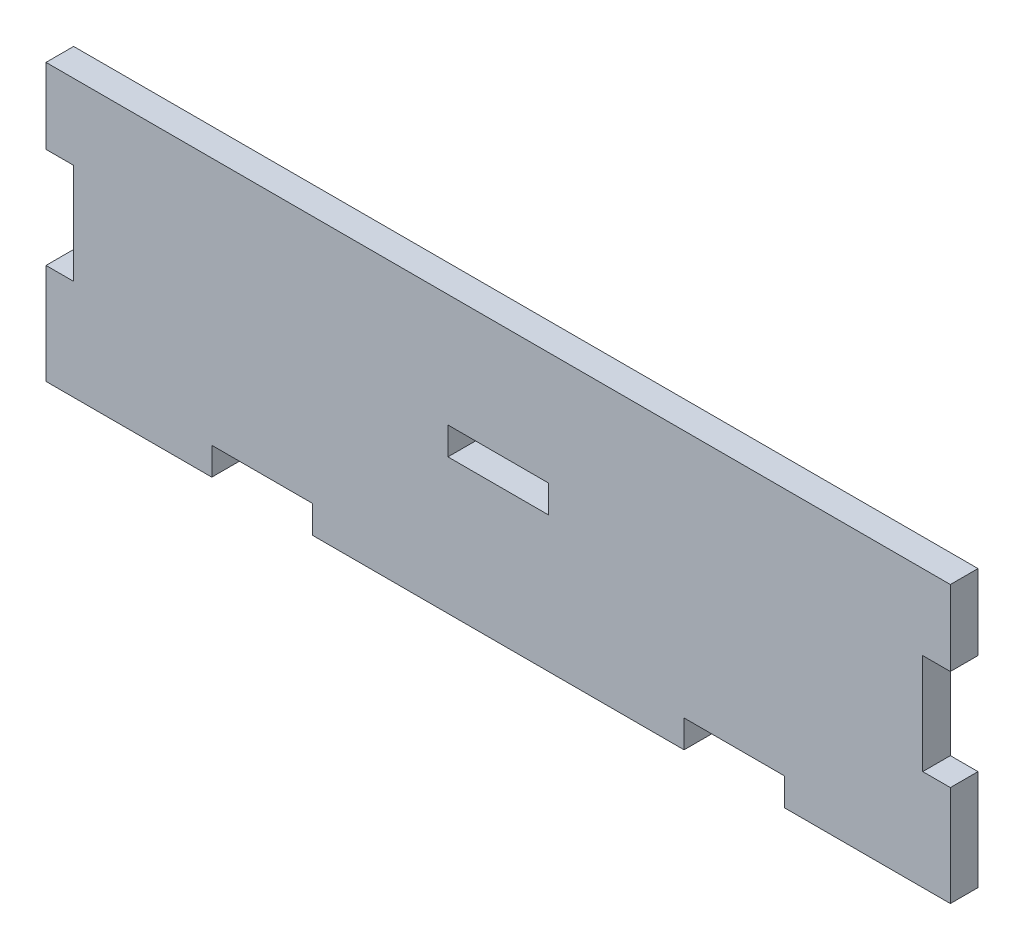
ISO-10303-21;
HEADER;
FILE_DESCRIPTION(('STEP AP214'),'2;1');
FILE_NAME('part.step','',(''),(''),'','','');
FILE_SCHEMA(('AUTOMOTIVE_DESIGN { 1 0 10303 214 1 1 1 1 }'));
ENDSEC;
DATA;
#1=APPLICATION_CONTEXT('core data for automotive mechanical design processes');
#2=APPLICATION_PROTOCOL_DEFINITION('international standard','automotive_design',2000,#1);
#3=PRODUCT_CONTEXT('',#1,'mechanical');
#4=PRODUCT('Part','Part','',(#3));
#5=PRODUCT_RELATED_PRODUCT_CATEGORY('part','',(#4));
#6=PRODUCT_DEFINITION_FORMATION('','',#4);
#7=PRODUCT_DEFINITION_CONTEXT('part definition',#1,'design');
#8=PRODUCT_DEFINITION('design','',#6,#7);
#9=PRODUCT_DEFINITION_SHAPE('','',#8);
#10=(LENGTH_UNIT() NAMED_UNIT(*) SI_UNIT(.MILLI.,.METRE.));
#11=(NAMED_UNIT(*) PLANE_ANGLE_UNIT() SI_UNIT($,.RADIAN.));
#12=(NAMED_UNIT(*) SI_UNIT($,.STERADIAN.) SOLID_ANGLE_UNIT());
#13=UNCERTAINTY_MEASURE_WITH_UNIT(LENGTH_MEASURE(1.E-05),#10,'distance_accuracy_value','');
#14=(GEOMETRIC_REPRESENTATION_CONTEXT(3) GLOBAL_UNCERTAINTY_ASSIGNED_CONTEXT((#13)) GLOBAL_UNIT_ASSIGNED_CONTEXT((#10,
#11,#12)) REPRESENTATION_CONTEXT('',''));
#15=CARTESIAN_POINT('',(0.,0.,0.));
#16=DIRECTION('',(0.,0.,1.));
#17=DIRECTION('',(1.,0.,0.));
#18=AXIS2_PLACEMENT_3D('',#15,#16,#17);
#19=CARTESIAN_POINT('',(0.,0.,5.5));
#20=DIRECTION('',(1.,0.,0.));
#21=DIRECTION('',(0.,0.,-1.));
#22=AXIS2_PLACEMENT_3D('',#19,#20,#21);
#23=PLANE('',#22);
#24=DIRECTION('',(0.,-1.,0.));
#25=VECTOR('',#24,1.);
#26=CARTESIAN_POINT('',(0.,0.,0.));
#27=LINE('',#26,#25);
#28=CARTESIAN_POINT('',(0.,20.,0.));
#29=VERTEX_POINT('',#28);
#30=CARTESIAN_POINT('',(0.,0.,0.));
#31=VERTEX_POINT('',#30);
#32=EDGE_CURVE('E232',#29,#31,#27,.T.);
#33=ORIENTED_EDGE('',*,*,#32,.T.);
#34=DIRECTION('',(0.,0.,-1.));
#35=VECTOR('',#34,1.);
#36=CARTESIAN_POINT('',(0.,0.,5.5));
#37=LINE('',#36,#35);
#38=CARTESIAN_POINT('',(0.,0.,5.5));
#39=VERTEX_POINT('',#38);
#40=EDGE_CURVE('E11',#39,#31,#37,.T.);
#41=ORIENTED_EDGE('',*,*,#40,.F.);
#42=DIRECTION('',(0.,-1.,0.));
#43=VECTOR('',#42,1.);
#44=CARTESIAN_POINT('',(0.,0.,5.5));
#45=LINE('',#44,#43);
#46=CARTESIAN_POINT('',(0.,20.,5.5));
#47=VERTEX_POINT('',#46);
#48=EDGE_CURVE('E236',#47,#39,#45,.T.);
#49=ORIENTED_EDGE('',*,*,#48,.F.);
#50=DIRECTION('',(0.,0.,-1.));
#51=VECTOR('',#50,1.);
#52=CARTESIAN_POINT('',(0.,20.,5.5));
#53=LINE('',#52,#51);
#54=EDGE_CURVE('E278',#47,#29,#53,.T.);
#55=ORIENTED_EDGE('',*,*,#54,.T.);
#56=EDGE_LOOP('',(#33,#41,#49,#55));
#57=FACE_BOUND('',#56,.T.);
#58=ADVANCED_FACE('F39',(#57),#23,.F.);
#59=CARTESIAN_POINT('',(0.,0.,5.5));
#60=DIRECTION('',(0.,1.,0.));
#61=DIRECTION('',(-1.,0.,0.));
#62=AXIS2_PLACEMENT_3D('',#59,#60,#61);
#63=PLANE('',#62);
#64=DIRECTION('',(1.,0.,0.));
#65=VECTOR('',#64,1.);
#66=CARTESIAN_POINT('',(0.,0.,0.));
#67=LINE('',#66,#65);
#68=CARTESIAN_POINT('',(33.,0.,0.));
#69=VERTEX_POINT('',#68);
#70=EDGE_CURVE('E281',#31,#69,#67,.T.);
#71=ORIENTED_EDGE('',*,*,#70,.T.);
#72=DIRECTION('',(0.,0.,-1.));
#73=VECTOR('',#72,1.);
#74=CARTESIAN_POINT('',(33.,0.,5.5));
#75=LINE('',#74,#73);
#76=CARTESIAN_POINT('',(33.,0.,5.5));
#77=VERTEX_POINT('',#76);
#78=EDGE_CURVE('E46',#77,#69,#75,.T.);
#79=ORIENTED_EDGE('',*,*,#78,.F.);
#80=DIRECTION('',(1.,0.,0.));
#81=VECTOR('',#80,1.);
#82=CARTESIAN_POINT('',(0.,0.,5.5));
#83=LINE('',#82,#81);
#84=EDGE_CURVE('E239',#39,#77,#83,.T.);
#85=ORIENTED_EDGE('',*,*,#84,.F.);
#86=ORIENTED_EDGE('',*,*,#40,.T.);
#87=EDGE_LOOP('',(#71,#79,#85,#86));
#88=FACE_BOUND('',#87,.T.);
#89=ADVANCED_FACE('F396',(#88),#63,.F.);
#90=CARTESIAN_POINT('',(33.,5.5,5.5));
#91=DIRECTION('',(-1.,0.,0.));
#92=DIRECTION('',(0.,0.,1.));
#93=AXIS2_PLACEMENT_3D('',#90,#91,#92);
#94=PLANE('',#93);
#95=DIRECTION('',(0.,1.,0.));
#96=VECTOR('',#95,1.);
#97=CARTESIAN_POINT('',(33.,5.5,0.));
#98=LINE('',#97,#96);
#99=CARTESIAN_POINT('',(33.,5.5,0.));
#100=VERTEX_POINT('',#99);
#101=EDGE_CURVE('E283',#69,#100,#98,.T.);
#102=ORIENTED_EDGE('',*,*,#101,.T.);
#103=DIRECTION('',(0.,0.,-1.));
#104=VECTOR('',#103,1.);
#105=CARTESIAN_POINT('',(33.,5.5,5.5));
#106=LINE('',#105,#104);
#107=CARTESIAN_POINT('',(33.,5.5,5.5));
#108=VERTEX_POINT('',#107);
#109=EDGE_CURVE('E368',#108,#100,#106,.T.);
#110=ORIENTED_EDGE('',*,*,#109,.F.);
#111=DIRECTION('',(0.,1.,0.));
#112=VECTOR('',#111,1.);
#113=CARTESIAN_POINT('',(33.,5.5,5.5));
#114=LINE('',#113,#112);
#115=EDGE_CURVE('E242',#77,#108,#114,.T.);
#116=ORIENTED_EDGE('',*,*,#115,.F.);
#117=ORIENTED_EDGE('',*,*,#78,.T.);
#118=EDGE_LOOP('',(#102,#110,#116,#117));
#119=FACE_BOUND('',#118,.T.);
#120=ADVANCED_FACE('F375',(#119),#94,.F.);
#121=CARTESIAN_POINT('',(33.,5.5,5.5));
#122=DIRECTION('',(0.,1.,0.));
#123=DIRECTION('',(0.,0.,1.));
#124=AXIS2_PLACEMENT_3D('',#121,#122,#123);
#125=PLANE('',#124);
#126=DIRECTION('',(1.,0.,0.));
#127=VECTOR('',#126,1.);
#128=CARTESIAN_POINT('',(33.,5.5,0.));
#129=LINE('',#128,#127);
#130=CARTESIAN_POINT('',(53.,5.5,0.));
#131=VERTEX_POINT('',#130);
#132=EDGE_CURVE('E285',#100,#131,#129,.T.);
#133=ORIENTED_EDGE('',*,*,#132,.T.);
#134=DIRECTION('',(0.,0.,-1.));
#135=VECTOR('',#134,1.);
#136=CARTESIAN_POINT('',(53.,5.5,5.5));
#137=LINE('',#136,#135);
#138=CARTESIAN_POINT('',(53.,5.5,5.5));
#139=VERTEX_POINT('',#138);
#140=EDGE_CURVE('E365',#139,#131,#137,.T.);
#141=ORIENTED_EDGE('',*,*,#140,.F.);
#142=DIRECTION('',(1.,0.,0.));
#143=VECTOR('',#142,1.);
#144=CARTESIAN_POINT('',(33.,5.5,5.5));
#145=LINE('',#144,#143);
#146=EDGE_CURVE('E244',#108,#139,#145,.T.);
#147=ORIENTED_EDGE('',*,*,#146,.F.);
#148=ORIENTED_EDGE('',*,*,#109,.T.);
#149=EDGE_LOOP('',(#133,#141,#147,#148));
#150=FACE_BOUND('',#149,.T.);
#151=ADVANCED_FACE('F384',(#150),#125,.F.);
#152=CARTESIAN_POINT('',(53.,5.5,5.5));
#153=DIRECTION('',(1.,0.,0.));
#154=DIRECTION('',(0.,0.,-1.));
#155=AXIS2_PLACEMENT_3D('',#152,#153,#154);
#156=PLANE('',#155);
#157=DIRECTION('',(0.,-1.,0.));
#158=VECTOR('',#157,1.);
#159=CARTESIAN_POINT('',(53.,5.5,0.));
#160=LINE('',#159,#158);
#161=CARTESIAN_POINT('',(53.,0.,0.));
#162=VERTEX_POINT('',#161);
#163=EDGE_CURVE('E287',#131,#162,#160,.T.);
#164=ORIENTED_EDGE('',*,*,#163,.T.);
#165=DIRECTION('',(0.,0.,-1.));
#166=VECTOR('',#165,1.);
#167=CARTESIAN_POINT('',(53.,0.,5.5));
#168=LINE('',#167,#166);
#169=CARTESIAN_POINT('',(53.,0.,5.5));
#170=VERTEX_POINT('',#169);
#171=EDGE_CURVE('E362',#170,#162,#168,.T.);
#172=ORIENTED_EDGE('',*,*,#171,.F.);
#173=DIRECTION('',(0.,-1.,0.));
#174=VECTOR('',#173,1.);
#175=CARTESIAN_POINT('',(53.,5.5,5.5));
#176=LINE('',#175,#174);
#177=EDGE_CURVE('E246',#139,#170,#176,.T.);
#178=ORIENTED_EDGE('',*,*,#177,.F.);
#179=ORIENTED_EDGE('',*,*,#140,.T.);
#180=EDGE_LOOP('',(#164,#172,#178,#179));
#181=FACE_BOUND('',#180,.T.);
#182=ADVANCED_FACE('F388',(#181),#156,.F.);
#183=CARTESIAN_POINT('',(53.,0.,5.5));
#184=DIRECTION('',(0.,1.,0.));
#185=DIRECTION('',(-1.,0.,0.));
#186=AXIS2_PLACEMENT_3D('',#183,#184,#185);
#187=PLANE('',#186);
#188=DIRECTION('',(1.,0.,0.));
#189=VECTOR('',#188,1.);
#190=CARTESIAN_POINT('',(53.,0.,0.));
#191=LINE('',#190,#189);
#192=CARTESIAN_POINT('',(127.,0.,0.));
#193=VERTEX_POINT('',#192);
#194=EDGE_CURVE('E289',#162,#193,#191,.T.);
#195=ORIENTED_EDGE('',*,*,#194,.T.);
#196=DIRECTION('',(0.,0.,-1.));
#197=VECTOR('',#196,1.);
#198=CARTESIAN_POINT('',(127.,0.,5.5));
#199=LINE('',#198,#197);
#200=CARTESIAN_POINT('',(127.,0.,5.5));
#201=VERTEX_POINT('',#200);
#202=EDGE_CURVE('E359',#201,#193,#199,.T.);
#203=ORIENTED_EDGE('',*,*,#202,.F.);
#204=DIRECTION('',(1.,0.,0.));
#205=VECTOR('',#204,1.);
#206=CARTESIAN_POINT('',(53.,0.,5.5));
#207=LINE('',#206,#205);
#208=EDGE_CURVE('E248',#170,#201,#207,.T.);
#209=ORIENTED_EDGE('',*,*,#208,.F.);
#210=ORIENTED_EDGE('',*,*,#171,.T.);
#211=EDGE_LOOP('',(#195,#203,#209,#210));
#212=FACE_BOUND('',#211,.T.);
#213=ADVANCED_FACE('F469',(#212),#187,.F.);
#214=CARTESIAN_POINT('',(127.,5.50000000000001,5.5));
#215=DIRECTION('',(-1.,0.,0.));
#216=DIRECTION('',(0.,0.,1.));
#217=AXIS2_PLACEMENT_3D('',#214,#215,#216);
#218=PLANE('',#217);
#219=DIRECTION('',(0.,1.,0.));
#220=VECTOR('',#219,1.);
#221=CARTESIAN_POINT('',(127.,5.50000000000001,0.));
#222=LINE('',#221,#220);
#223=CARTESIAN_POINT('',(127.,5.50000000000001,0.));
#224=VERTEX_POINT('',#223);
#225=EDGE_CURVE('E291',#193,#224,#222,.T.);
#226=ORIENTED_EDGE('',*,*,#225,.T.);
#227=DIRECTION('',(0.,0.,-1.));
#228=VECTOR('',#227,1.);
#229=CARTESIAN_POINT('',(127.,5.50000000000001,5.5));
#230=LINE('',#229,#228);
#231=CARTESIAN_POINT('',(127.,5.50000000000001,5.5));
#232=VERTEX_POINT('',#231);
#233=EDGE_CURVE('E356',#232,#224,#230,.T.);
#234=ORIENTED_EDGE('',*,*,#233,.F.);
#235=DIRECTION('',(0.,1.,0.));
#236=VECTOR('',#235,1.);
#237=CARTESIAN_POINT('',(127.,5.50000000000001,5.5));
#238=LINE('',#237,#236);
#239=EDGE_CURVE('E250',#201,#232,#238,.T.);
#240=ORIENTED_EDGE('',*,*,#239,.F.);
#241=ORIENTED_EDGE('',*,*,#202,.T.);
#242=EDGE_LOOP('',(#226,#234,#240,#241));
#243=FACE_BOUND('',#242,.T.);
#244=ADVANCED_FACE('F467',(#243),#218,.F.);
#245=CARTESIAN_POINT('',(147.,5.50000000000001,5.5));
#246=DIRECTION('',(0.,1.,0.));
#247=DIRECTION('',(-1.,0.,0.));
#248=AXIS2_PLACEMENT_3D('',#245,#246,#247);
#249=PLANE('',#248);
#250=DIRECTION('',(1.,0.,0.));
#251=VECTOR('',#250,1.);
#252=CARTESIAN_POINT('',(147.,5.50000000000001,0.));
#253=LINE('',#252,#251);
#254=CARTESIAN_POINT('',(147.,5.50000000000001,0.));
#255=VERTEX_POINT('',#254);
#256=EDGE_CURVE('E293',#224,#255,#253,.T.);
#257=ORIENTED_EDGE('',*,*,#256,.T.);
#258=DIRECTION('',(0.,0.,-1.));
#259=VECTOR('',#258,1.);
#260=CARTESIAN_POINT('',(147.,5.50000000000001,5.5));
#261=LINE('',#260,#259);
#262=CARTESIAN_POINT('',(147.,5.50000000000001,5.5));
#263=VERTEX_POINT('',#262);
#264=EDGE_CURVE('E353',#263,#255,#261,.T.);
#265=ORIENTED_EDGE('',*,*,#264,.F.);
#266=DIRECTION('',(1.,0.,0.));
#267=VECTOR('',#266,1.);
#268=CARTESIAN_POINT('',(147.,5.50000000000001,5.5));
#269=LINE('',#268,#267);
#270=EDGE_CURVE('E252',#232,#263,#269,.T.);
#271=ORIENTED_EDGE('',*,*,#270,.F.);
#272=ORIENTED_EDGE('',*,*,#233,.T.);
#273=EDGE_LOOP('',(#257,#265,#271,#272));
#274=FACE_BOUND('',#273,.T.);
#275=ADVANCED_FACE('F462',(#274),#249,.F.);
#276=CARTESIAN_POINT('',(147.,5.50000000000001,5.5));
#277=DIRECTION('',(1.,0.,0.));
#278=DIRECTION('',(0.,0.,-1.));
#279=AXIS2_PLACEMENT_3D('',#276,#277,#278);
#280=PLANE('',#279);
#281=DIRECTION('',(0.,-1.,0.));
#282=VECTOR('',#281,1.);
#283=CARTESIAN_POINT('',(147.,5.50000000000001,0.));
#284=LINE('',#283,#282);
#285=CARTESIAN_POINT('',(147.,0.,0.));
#286=VERTEX_POINT('',#285);
#287=EDGE_CURVE('E295',#255,#286,#284,.T.);
#288=ORIENTED_EDGE('',*,*,#287,.T.);
#289=DIRECTION('',(0.,0.,-1.));
#290=VECTOR('',#289,1.);
#291=CARTESIAN_POINT('',(147.,0.,5.5));
#292=LINE('',#291,#290);
#293=CARTESIAN_POINT('',(147.,0.,5.5));
#294=VERTEX_POINT('',#293);
#295=EDGE_CURVE('E350',#294,#286,#292,.T.);
#296=ORIENTED_EDGE('',*,*,#295,.F.);
#297=DIRECTION('',(0.,-1.,0.));
#298=VECTOR('',#297,1.);
#299=CARTESIAN_POINT('',(147.,5.50000000000001,5.5));
#300=LINE('',#299,#298);
#301=EDGE_CURVE('E254',#263,#294,#300,.T.);
#302=ORIENTED_EDGE('',*,*,#301,.F.);
#303=ORIENTED_EDGE('',*,*,#264,.T.);
#304=EDGE_LOOP('',(#288,#296,#302,#303));
#305=FACE_BOUND('',#304,.T.);
#306=ADVANCED_FACE('F457',(#305),#280,.F.);
#307=CARTESIAN_POINT('',(147.,0.,5.5));
#308=DIRECTION('',(0.,1.,0.));
#309=DIRECTION('',(-1.,0.,0.));
#310=AXIS2_PLACEMENT_3D('',#307,#308,#309);
#311=PLANE('',#310);
#312=DIRECTION('',(1.,0.,0.));
#313=VECTOR('',#312,1.);
#314=CARTESIAN_POINT('',(147.,0.,0.));
#315=LINE('',#314,#313);
#316=CARTESIAN_POINT('',(180.,0.,0.));
#317=VERTEX_POINT('',#316);
#318=EDGE_CURVE('E297',#286,#317,#315,.T.);
#319=ORIENTED_EDGE('',*,*,#318,.T.);
#320=DIRECTION('',(0.,0.,-1.));
#321=VECTOR('',#320,1.);
#322=CARTESIAN_POINT('',(180.,0.,5.5));
#323=LINE('',#322,#321);
#324=CARTESIAN_POINT('',(180.,0.,5.5));
#325=VERTEX_POINT('',#324);
#326=EDGE_CURVE('E347',#325,#317,#323,.T.);
#327=ORIENTED_EDGE('',*,*,#326,.F.);
#328=DIRECTION('',(1.,0.,0.));
#329=VECTOR('',#328,1.);
#330=CARTESIAN_POINT('',(147.,0.,5.5));
#331=LINE('',#330,#329);
#332=EDGE_CURVE('E256',#294,#325,#331,.T.);
#333=ORIENTED_EDGE('',*,*,#332,.F.);
#334=ORIENTED_EDGE('',*,*,#295,.T.);
#335=EDGE_LOOP('',(#319,#327,#333,#334));
#336=FACE_BOUND('',#335,.T.);
#337=ADVANCED_FACE('F453',(#336),#311,.F.);
#338=CARTESIAN_POINT('',(180.,0.,5.5));
#339=DIRECTION('',(-1.,0.,0.));
#340=DIRECTION('',(0.,0.,1.));
#341=AXIS2_PLACEMENT_3D('',#338,#339,#340);
#342=PLANE('',#341);
#343=DIRECTION('',(0.,1.,0.));
#344=VECTOR('',#343,1.);
#345=CARTESIAN_POINT('',(180.,0.,0.));
#346=LINE('',#345,#344);
#347=CARTESIAN_POINT('',(180.,20.,0.));
#348=VERTEX_POINT('',#347);
#349=EDGE_CURVE('E299',#317,#348,#346,.T.);
#350=ORIENTED_EDGE('',*,*,#349,.T.);
#351=DIRECTION('',(0.,0.,-1.));
#352=VECTOR('',#351,1.);
#353=CARTESIAN_POINT('',(180.,20.,5.5));
#354=LINE('',#353,#352);
#355=CARTESIAN_POINT('',(180.,20.,5.5));
#356=VERTEX_POINT('',#355);
#357=EDGE_CURVE('E344',#356,#348,#354,.T.);
#358=ORIENTED_EDGE('',*,*,#357,.F.);
#359=DIRECTION('',(0.,1.,0.));
#360=VECTOR('',#359,1.);
#361=CARTESIAN_POINT('',(180.,0.,5.5));
#362=LINE('',#361,#360);
#363=EDGE_CURVE('E258',#325,#356,#362,.T.);
#364=ORIENTED_EDGE('',*,*,#363,.F.);
#365=ORIENTED_EDGE('',*,*,#326,.T.);
#366=EDGE_LOOP('',(#350,#358,#364,#365));
#367=FACE_BOUND('',#366,.T.);
#368=ADVANCED_FACE('F448',(#367),#342,.F.);
#369=CARTESIAN_POINT('',(174.5,20.,5.5));
#370=DIRECTION('',(0.,-1.,0.));
#371=DIRECTION('',(0.,0.,-1.));
#372=AXIS2_PLACEMENT_3D('',#369,#370,#371);
#373=PLANE('',#372);
#374=DIRECTION('',(-1.,0.,0.));
#375=VECTOR('',#374,1.);
#376=CARTESIAN_POINT('',(174.5,20.,0.));
#377=LINE('',#376,#375);
#378=CARTESIAN_POINT('',(174.5,20.,0.));
#379=VERTEX_POINT('',#378);
#380=EDGE_CURVE('E301',#348,#379,#377,.T.);
#381=ORIENTED_EDGE('',*,*,#380,.T.);
#382=DIRECTION('',(0.,0.,-1.));
#383=VECTOR('',#382,1.);
#384=CARTESIAN_POINT('',(174.5,20.,5.5));
#385=LINE('',#384,#383);
#386=CARTESIAN_POINT('',(174.5,20.,5.5));
#387=VERTEX_POINT('',#386);
#388=EDGE_CURVE('E341',#387,#379,#385,.T.);
#389=ORIENTED_EDGE('',*,*,#388,.F.);
#390=DIRECTION('',(-1.,0.,0.));
#391=VECTOR('',#390,1.);
#392=CARTESIAN_POINT('',(174.5,20.,5.5));
#393=LINE('',#392,#391);
#394=EDGE_CURVE('E260',#356,#387,#393,.T.);
#395=ORIENTED_EDGE('',*,*,#394,.F.);
#396=ORIENTED_EDGE('',*,*,#357,.T.);
#397=EDGE_LOOP('',(#381,#389,#395,#396));
#398=FACE_BOUND('',#397,.T.);
#399=ADVANCED_FACE('F442',(#398),#373,.F.);
#400=CARTESIAN_POINT('',(174.5,20.,5.5));
#401=DIRECTION('',(-1.,0.,0.));
#402=DIRECTION('',(0.,0.,1.));
#403=AXIS2_PLACEMENT_3D('',#400,#401,#402);
#404=PLANE('',#403);
#405=DIRECTION('',(0.,1.,0.));
#406=VECTOR('',#405,1.);
#407=CARTESIAN_POINT('',(174.5,20.,0.));
#408=LINE('',#407,#406);
#409=CARTESIAN_POINT('',(174.5,40.,0.));
#410=VERTEX_POINT('',#409);
#411=EDGE_CURVE('E303',#379,#410,#408,.T.);
#412=ORIENTED_EDGE('',*,*,#411,.T.);
#413=DIRECTION('',(0.,0.,-1.));
#414=VECTOR('',#413,1.);
#415=CARTESIAN_POINT('',(174.5,40.,5.5));
#416=LINE('',#415,#414);
#417=CARTESIAN_POINT('',(174.5,40.,5.5));
#418=VERTEX_POINT('',#417);
#419=EDGE_CURVE('E338',#418,#410,#416,.T.);
#420=ORIENTED_EDGE('',*,*,#419,.F.);
#421=DIRECTION('',(0.,1.,0.));
#422=VECTOR('',#421,1.);
#423=CARTESIAN_POINT('',(174.5,20.,5.5));
#424=LINE('',#423,#422);
#425=EDGE_CURVE('E262',#387,#418,#424,.T.);
#426=ORIENTED_EDGE('',*,*,#425,.F.);
#427=ORIENTED_EDGE('',*,*,#388,.T.);
#428=EDGE_LOOP('',(#412,#420,#426,#427));
#429=FACE_BOUND('',#428,.T.);
#430=ADVANCED_FACE('F438',(#429),#404,.F.);
#431=CARTESIAN_POINT('',(174.5,40.,5.5));
#432=DIRECTION('',(0.,1.,0.));
#433=DIRECTION('',(0.,0.,1.));
#434=AXIS2_PLACEMENT_3D('',#431,#432,#433);
#435=PLANE('',#434);
#436=DIRECTION('',(1.,0.,0.));
#437=VECTOR('',#436,1.);
#438=CARTESIAN_POINT('',(174.5,40.,0.));
#439=LINE('',#438,#437);
#440=CARTESIAN_POINT('',(180.,40.,0.));
#441=VERTEX_POINT('',#440);
#442=EDGE_CURVE('E305',#410,#441,#439,.T.);
#443=ORIENTED_EDGE('',*,*,#442,.T.);
#444=DIRECTION('',(0.,0.,-1.));
#445=VECTOR('',#444,1.);
#446=CARTESIAN_POINT('',(180.,40.,5.5));
#447=LINE('',#446,#445);
#448=CARTESIAN_POINT('',(180.,40.,5.5));
#449=VERTEX_POINT('',#448);
#450=EDGE_CURVE('E335',#449,#441,#447,.T.);
#451=ORIENTED_EDGE('',*,*,#450,.F.);
#452=DIRECTION('',(1.,0.,0.));
#453=VECTOR('',#452,1.);
#454=CARTESIAN_POINT('',(174.5,40.,5.5));
#455=LINE('',#454,#453);
#456=EDGE_CURVE('E264',#418,#449,#455,.T.);
#457=ORIENTED_EDGE('',*,*,#456,.F.);
#458=ORIENTED_EDGE('',*,*,#419,.T.);
#459=EDGE_LOOP('',(#443,#451,#457,#458));
#460=FACE_BOUND('',#459,.T.);
#461=ADVANCED_FACE('F433',(#460),#435,.F.);
#462=CARTESIAN_POINT('',(180.,40.,5.5));
#463=DIRECTION('',(-1.,0.,0.));
#464=DIRECTION('',(0.,0.,1.));
#465=AXIS2_PLACEMENT_3D('',#462,#463,#464);
#466=PLANE('',#465);
#467=DIRECTION('',(0.,1.,0.));
#468=VECTOR('',#467,1.);
#469=CARTESIAN_POINT('',(180.,40.,0.));
#470=LINE('',#469,#468);
#471=CARTESIAN_POINT('',(180.,55.,0.));
#472=VERTEX_POINT('',#471);
#473=EDGE_CURVE('E307',#441,#472,#470,.T.);
#474=ORIENTED_EDGE('',*,*,#473,.T.);
#475=DIRECTION('',(0.,0.,-1.));
#476=VECTOR('',#475,1.);
#477=CARTESIAN_POINT('',(180.,55.,5.5));
#478=LINE('',#477,#476);
#479=CARTESIAN_POINT('',(180.,55.,5.5));
#480=VERTEX_POINT('',#479);
#481=EDGE_CURVE('E332',#480,#472,#478,.T.);
#482=ORIENTED_EDGE('',*,*,#481,.F.);
#483=DIRECTION('',(0.,1.,0.));
#484=VECTOR('',#483,1.);
#485=CARTESIAN_POINT('',(180.,40.,5.5));
#486=LINE('',#485,#484);
#487=EDGE_CURVE('E266',#449,#480,#486,.T.);
#488=ORIENTED_EDGE('',*,*,#487,.F.);
#489=ORIENTED_EDGE('',*,*,#450,.T.);
#490=EDGE_LOOP('',(#474,#482,#488,#489));
#491=FACE_BOUND('',#490,.T.);
#492=ADVANCED_FACE('F427',(#491),#466,.F.);
#493=CARTESIAN_POINT('',(0.,55.,5.5));
#494=DIRECTION('',(0.,-1.,0.));
#495=DIRECTION('',(0.,0.,-1.));
#496=AXIS2_PLACEMENT_3D('',#493,#494,#495);
#497=PLANE('',#496);
#498=DIRECTION('',(-1.,0.,0.));
#499=VECTOR('',#498,1.);
#500=CARTESIAN_POINT('',(0.,55.,0.));
#501=LINE('',#500,#499);
#502=CARTESIAN_POINT('',(0.,55.,0.));
#503=VERTEX_POINT('',#502);
#504=EDGE_CURVE('E309',#472,#503,#501,.T.);
#505=ORIENTED_EDGE('',*,*,#504,.T.);
#506=DIRECTION('',(0.,0.,-1.));
#507=VECTOR('',#506,1.);
#508=CARTESIAN_POINT('',(0.,55.,5.5));
#509=LINE('',#508,#507);
#510=CARTESIAN_POINT('',(0.,55.,5.5));
#511=VERTEX_POINT('',#510);
#512=EDGE_CURVE('E329',#511,#503,#509,.T.);
#513=ORIENTED_EDGE('',*,*,#512,.F.);
#514=DIRECTION('',(-1.,0.,0.));
#515=VECTOR('',#514,1.);
#516=CARTESIAN_POINT('',(0.,55.,5.5));
#517=LINE('',#516,#515);
#518=EDGE_CURVE('E268',#480,#511,#517,.T.);
#519=ORIENTED_EDGE('',*,*,#518,.F.);
#520=ORIENTED_EDGE('',*,*,#481,.T.);
#521=EDGE_LOOP('',(#505,#513,#519,#520));
#522=FACE_BOUND('',#521,.T.);
#523=ADVANCED_FACE('F423',(#522),#497,.F.);
#524=CARTESIAN_POINT('',(0.,40.,5.5));
#525=DIRECTION('',(1.,0.,0.));
#526=DIRECTION('',(0.,0.,-1.));
#527=AXIS2_PLACEMENT_3D('',#524,#525,#526);
#528=PLANE('',#527);
#529=DIRECTION('',(0.,-1.,0.));
#530=VECTOR('',#529,1.);
#531=CARTESIAN_POINT('',(0.,40.,0.));
#532=LINE('',#531,#530);
#533=CARTESIAN_POINT('',(0.,40.,0.));
#534=VERTEX_POINT('',#533);
#535=EDGE_CURVE('E311',#503,#534,#532,.T.);
#536=ORIENTED_EDGE('',*,*,#535,.T.);
#537=DIRECTION('',(0.,0.,-1.));
#538=VECTOR('',#537,1.);
#539=CARTESIAN_POINT('',(0.,40.,5.5));
#540=LINE('',#539,#538);
#541=CARTESIAN_POINT('',(0.,40.,5.5));
#542=VERTEX_POINT('',#541);
#543=EDGE_CURVE('E326',#542,#534,#540,.T.);
#544=ORIENTED_EDGE('',*,*,#543,.F.);
#545=DIRECTION('',(0.,-1.,0.));
#546=VECTOR('',#545,1.);
#547=CARTESIAN_POINT('',(0.,40.,5.5));
#548=LINE('',#547,#546);
#549=EDGE_CURVE('E270',#511,#542,#548,.T.);
#550=ORIENTED_EDGE('',*,*,#549,.F.);
#551=ORIENTED_EDGE('',*,*,#512,.T.);
#552=EDGE_LOOP('',(#536,#544,#550,#551));
#553=FACE_BOUND('',#552,.T.);
#554=ADVANCED_FACE('F418',(#553),#528,.F.);
#555=CARTESIAN_POINT('',(0.,40.,5.5));
#556=DIRECTION('',(0.,1.,0.));
#557=DIRECTION('',(0.,0.,1.));
#558=AXIS2_PLACEMENT_3D('',#555,#556,#557);
#559=PLANE('',#558);
#560=DIRECTION('',(1.,0.,0.));
#561=VECTOR('',#560,1.);
#562=CARTESIAN_POINT('',(0.,40.,0.));
#563=LINE('',#562,#561);
#564=CARTESIAN_POINT('',(5.49999999999999,40.,0.));
#565=VERTEX_POINT('',#564);
#566=EDGE_CURVE('E313',#534,#565,#563,.T.);
#567=ORIENTED_EDGE('',*,*,#566,.T.);
#568=DIRECTION('',(0.,0.,-1.));
#569=VECTOR('',#568,1.);
#570=CARTESIAN_POINT('',(5.49999999999999,40.,5.5));
#571=LINE('',#570,#569);
#572=CARTESIAN_POINT('',(5.49999999999999,40.,5.5));
#573=VERTEX_POINT('',#572);
#574=EDGE_CURVE('E323',#573,#565,#571,.T.);
#575=ORIENTED_EDGE('',*,*,#574,.F.);
#576=DIRECTION('',(1.,0.,0.));
#577=VECTOR('',#576,1.);
#578=CARTESIAN_POINT('',(0.,40.,5.5));
#579=LINE('',#578,#577);
#580=EDGE_CURVE('E272',#542,#573,#579,.T.);
#581=ORIENTED_EDGE('',*,*,#580,.F.);
#582=ORIENTED_EDGE('',*,*,#543,.T.);
#583=EDGE_LOOP('',(#567,#575,#581,#582));
#584=FACE_BOUND('',#583,.T.);
#585=ADVANCED_FACE('F412',(#584),#559,.F.);
#586=CARTESIAN_POINT('',(5.49999999999999,20.,5.5));
#587=DIRECTION('',(1.,0.,0.));
#588=DIRECTION('',(0.,1.,0.));
#589=AXIS2_PLACEMENT_3D('',#586,#587,#588);
#590=PLANE('',#589);
#591=DIRECTION('',(0.,-1.,0.));
#592=VECTOR('',#591,1.);
#593=CARTESIAN_POINT('',(5.49999999999999,20.,0.));
#594=LINE('',#593,#592);
#595=CARTESIAN_POINT('',(5.49999999999999,20.,0.));
#596=VERTEX_POINT('',#595);
#597=EDGE_CURVE('E315',#565,#596,#594,.T.);
#598=ORIENTED_EDGE('',*,*,#597,.T.);
#599=DIRECTION('',(0.,0.,-1.));
#600=VECTOR('',#599,1.);
#601=CARTESIAN_POINT('',(5.49999999999999,20.,5.5));
#602=LINE('',#601,#600);
#603=CARTESIAN_POINT('',(5.49999999999999,20.,5.5));
#604=VERTEX_POINT('',#603);
#605=EDGE_CURVE('E320',#604,#596,#602,.T.);
#606=ORIENTED_EDGE('',*,*,#605,.F.);
#607=DIRECTION('',(0.,-1.,0.));
#608=VECTOR('',#607,1.);
#609=CARTESIAN_POINT('',(5.49999999999999,20.,5.5));
#610=LINE('',#609,#608);
#611=EDGE_CURVE('E274',#573,#604,#610,.T.);
#612=ORIENTED_EDGE('',*,*,#611,.F.);
#613=ORIENTED_EDGE('',*,*,#574,.T.);
#614=EDGE_LOOP('',(#598,#606,#612,#613));
#615=FACE_BOUND('',#614,.T.);
#616=ADVANCED_FACE('F408',(#615),#590,.F.);
#617=CARTESIAN_POINT('',(0.,20.,5.5));
#618=DIRECTION('',(0.,-1.,0.));
#619=DIRECTION('',(0.,0.,-1.));
#620=AXIS2_PLACEMENT_3D('',#617,#618,#619);
#621=PLANE('',#620);
#622=DIRECTION('',(-1.,0.,0.));
#623=VECTOR('',#622,1.);
#624=CARTESIAN_POINT('',(0.,20.,0.));
#625=LINE('',#624,#623);
#626=EDGE_CURVE('E240',#596,#29,#625,.T.);
#627=ORIENTED_EDGE('',*,*,#626,.T.);
#628=ORIENTED_EDGE('',*,*,#54,.F.);
#629=DIRECTION('',(-1.,0.,0.));
#630=VECTOR('',#629,1.);
#631=CARTESIAN_POINT('',(0.,20.,5.5));
#632=LINE('',#631,#630);
#633=EDGE_CURVE('E276',#604,#47,#632,.T.);
#634=ORIENTED_EDGE('',*,*,#633,.F.);
#635=ORIENTED_EDGE('',*,*,#605,.T.);
#636=EDGE_LOOP('',(#627,#628,#634,#635));
#637=FACE_BOUND('',#636,.T.);
#638=ADVANCED_FACE('F403',(#637),#621,.F.);
#639=CARTESIAN_POINT('',(0.,0.,5.5));
#640=DIRECTION('',(0.,0.,-1.));
#641=DIRECTION('',(-1.,0.,0.));
#642=AXIS2_PLACEMENT_3D('',#639,#640,#641);
#643=PLANE('',#642);
#644=DIRECTION('',(1.,0.,0.));
#645=VECTOR('',#644,1.);
#646=CARTESIAN_POINT('',(80.,27.0000000000002,5.5));
#647=LINE('',#646,#645);
#648=CARTESIAN_POINT('',(80.,27.0000000000002,5.5));
#649=VERTEX_POINT('',#648);
#650=CARTESIAN_POINT('',(100.,27.0000000000002,5.5));
#651=VERTEX_POINT('',#650);
#652=EDGE_CURVE('E226',#649,#651,#647,.T.);
#653=ORIENTED_EDGE('',*,*,#652,.F.);
#654=DIRECTION('',(0.,-1.,0.));
#655=VECTOR('',#654,1.);
#656=CARTESIAN_POINT('',(80.,32.5000000000002,5.5));
#657=LINE('',#656,#655);
#658=CARTESIAN_POINT('',(80.,32.5000000000002,5.5));
#659=VERTEX_POINT('',#658);
#660=EDGE_CURVE('E53',#659,#649,#657,.T.);
#661=ORIENTED_EDGE('',*,*,#660,.F.);
#662=DIRECTION('',(-1.,0.,0.));
#663=VECTOR('',#662,1.);
#664=CARTESIAN_POINT('',(80.,32.5000000000002,5.5));
#665=LINE('',#664,#663);
#666=CARTESIAN_POINT('',(100.,32.5000000000002,5.5));
#667=VERTEX_POINT('',#666);
#668=EDGE_CURVE('E217',#667,#659,#665,.T.);
#669=ORIENTED_EDGE('',*,*,#668,.F.);
#670=DIRECTION('',(0.,1.,0.));
#671=VECTOR('',#670,1.);
#672=CARTESIAN_POINT('',(100.,32.5000000000002,5.5));
#673=LINE('',#672,#671);
#674=EDGE_CURVE('E220',#651,#667,#673,.T.);
#675=ORIENTED_EDGE('',*,*,#674,.F.);
#676=EDGE_LOOP('',(#653,#661,#669,#675));
#677=FACE_BOUND('',#676,.T.);
#678=ORIENTED_EDGE('',*,*,#48,.T.);
#679=ORIENTED_EDGE('',*,*,#84,.T.);
#680=ORIENTED_EDGE('',*,*,#115,.T.);
#681=ORIENTED_EDGE('',*,*,#146,.T.);
#682=ORIENTED_EDGE('',*,*,#177,.T.);
#683=ORIENTED_EDGE('',*,*,#208,.T.);
#684=ORIENTED_EDGE('',*,*,#239,.T.);
#685=ORIENTED_EDGE('',*,*,#270,.T.);
#686=ORIENTED_EDGE('',*,*,#301,.T.);
#687=ORIENTED_EDGE('',*,*,#332,.T.);
#688=ORIENTED_EDGE('',*,*,#363,.T.);
#689=ORIENTED_EDGE('',*,*,#394,.T.);
#690=ORIENTED_EDGE('',*,*,#425,.T.);
#691=ORIENTED_EDGE('',*,*,#456,.T.);
#692=ORIENTED_EDGE('',*,*,#487,.T.);
#693=ORIENTED_EDGE('',*,*,#518,.T.);
#694=ORIENTED_EDGE('',*,*,#549,.T.);
#695=ORIENTED_EDGE('',*,*,#580,.T.);
#696=ORIENTED_EDGE('',*,*,#611,.T.);
#697=ORIENTED_EDGE('',*,*,#633,.T.);
#698=EDGE_LOOP('',(#678,#679,#680,#681,#682,#683,#684,#685,#686,#687,#688,#689,#690,#691,#692,
#693,#694,#695,#696,#697));
#699=FACE_BOUND('',#698,.T.);
#700=ADVANCED_FACE('F392',(#677,#699),#643,.F.);
#701=CARTESIAN_POINT('',(0.,0.,0.));
#702=DIRECTION('',(0.,0.,-1.));
#703=DIRECTION('',(-1.,0.,0.));
#704=AXIS2_PLACEMENT_3D('',#701,#702,#703);
#705=PLANE('',#704);
#706=DIRECTION('',(0.,-1.,0.));
#707=VECTOR('',#706,1.);
#708=CARTESIAN_POINT('',(80.,32.5000000000002,0.));
#709=LINE('',#708,#707);
#710=CARTESIAN_POINT('',(80.,32.5000000000002,0.));
#711=VERTEX_POINT('',#710);
#712=CARTESIAN_POINT('',(80.,27.0000000000002,0.));
#713=VERTEX_POINT('',#712);
#714=EDGE_CURVE('E201',#711,#713,#709,.T.);
#715=ORIENTED_EDGE('',*,*,#714,.T.);
#716=DIRECTION('',(1.,0.,0.));
#717=VECTOR('',#716,1.);
#718=CARTESIAN_POINT('',(80.,27.0000000000002,0.));
#719=LINE('',#718,#717);
#720=CARTESIAN_POINT('',(100.,27.0000000000002,0.));
#721=VERTEX_POINT('',#720);
#722=EDGE_CURVE('E210',#713,#721,#719,.T.);
#723=ORIENTED_EDGE('',*,*,#722,.T.);
#724=DIRECTION('',(0.,1.,0.));
#725=VECTOR('',#724,1.);
#726=CARTESIAN_POINT('',(100.,32.5000000000002,0.));
#727=LINE('',#726,#725);
#728=CARTESIAN_POINT('',(100.,32.5000000000002,0.));
#729=VERTEX_POINT('',#728);
#730=EDGE_CURVE('E61',#721,#729,#727,.T.);
#731=ORIENTED_EDGE('',*,*,#730,.T.);
#732=DIRECTION('',(-1.,0.,0.));
#733=VECTOR('',#732,1.);
#734=CARTESIAN_POINT('',(80.,32.5000000000002,0.));
#735=LINE('',#734,#733);
#736=EDGE_CURVE('E207',#729,#711,#735,.T.);
#737=ORIENTED_EDGE('',*,*,#736,.T.);
#738=EDGE_LOOP('',(#715,#723,#731,#737));
#739=FACE_BOUND('',#738,.T.);
#740=ORIENTED_EDGE('',*,*,#32,.F.);
#741=ORIENTED_EDGE('',*,*,#626,.F.);
#742=ORIENTED_EDGE('',*,*,#597,.F.);
#743=ORIENTED_EDGE('',*,*,#566,.F.);
#744=ORIENTED_EDGE('',*,*,#535,.F.);
#745=ORIENTED_EDGE('',*,*,#504,.F.);
#746=ORIENTED_EDGE('',*,*,#473,.F.);
#747=ORIENTED_EDGE('',*,*,#442,.F.);
#748=ORIENTED_EDGE('',*,*,#411,.F.);
#749=ORIENTED_EDGE('',*,*,#380,.F.);
#750=ORIENTED_EDGE('',*,*,#349,.F.);
#751=ORIENTED_EDGE('',*,*,#318,.F.);
#752=ORIENTED_EDGE('',*,*,#287,.F.);
#753=ORIENTED_EDGE('',*,*,#256,.F.);
#754=ORIENTED_EDGE('',*,*,#225,.F.);
#755=ORIENTED_EDGE('',*,*,#194,.F.);
#756=ORIENTED_EDGE('',*,*,#163,.F.);
#757=ORIENTED_EDGE('',*,*,#132,.F.);
#758=ORIENTED_EDGE('',*,*,#101,.F.);
#759=ORIENTED_EDGE('',*,*,#70,.F.);
#760=EDGE_LOOP('',(#740,#741,#742,#743,#744,#745,#746,#747,#748,#749,#750,#751,#752,#753,#754,
#755,#756,#757,#758,#759));
#761=FACE_BOUND('',#760,.T.);
#762=ADVANCED_FACE('F214',(#739,#761),#705,.T.);
#763=CARTESIAN_POINT('',(80.,32.5000000000002,0.));
#764=DIRECTION('',(-1.,0.,0.));
#765=DIRECTION('',(0.,0.,1.));
#766=AXIS2_PLACEMENT_3D('',#763,#764,#765);
#767=PLANE('',#766);
#768=ORIENTED_EDGE('',*,*,#660,.T.);
#769=DIRECTION('',(0.,0.,1.));
#770=VECTOR('',#769,1.);
#771=CARTESIAN_POINT('',(80.,27.0000000000002,0.));
#772=LINE('',#771,#770);
#773=EDGE_CURVE('E197',#713,#649,#772,.T.);
#774=ORIENTED_EDGE('',*,*,#773,.F.);
#775=ORIENTED_EDGE('',*,*,#714,.F.);
#776=DIRECTION('',(0.,0.,1.));
#777=VECTOR('',#776,1.);
#778=CARTESIAN_POINT('',(80.,32.5000000000002,0.));
#779=LINE('',#778,#777);
#780=EDGE_CURVE('E230',#711,#659,#779,.T.);
#781=ORIENTED_EDGE('',*,*,#780,.T.);
#782=EDGE_LOOP('',(#768,#774,#775,#781));
#783=FACE_BOUND('',#782,.T.);
#784=ADVANCED_FACE('F199',(#783),#767,.F.);
#785=CARTESIAN_POINT('',(80.,32.5000000000002,0.));
#786=DIRECTION('',(0.,1.,0.));
#787=DIRECTION('',(0.,0.,1.));
#788=AXIS2_PLACEMENT_3D('',#785,#786,#787);
#789=PLANE('',#788);
#790=ORIENTED_EDGE('',*,*,#668,.T.);
#791=ORIENTED_EDGE('',*,*,#780,.F.);
#792=ORIENTED_EDGE('',*,*,#736,.F.);
#793=DIRECTION('',(0.,0.,1.));
#794=VECTOR('',#793,1.);
#795=CARTESIAN_POINT('',(100.,32.5000000000002,0.));
#796=LINE('',#795,#794);
#797=EDGE_CURVE('E233',#729,#667,#796,.T.);
#798=ORIENTED_EDGE('',*,*,#797,.T.);
#799=EDGE_LOOP('',(#790,#791,#792,#798));
#800=FACE_BOUND('',#799,.T.);
#801=ADVANCED_FACE('F638',(#800),#789,.F.);
#802=CARTESIAN_POINT('',(100.,32.5000000000002,0.));
#803=DIRECTION('',(1.,0.,0.));
#804=DIRECTION('',(0.,0.,-1.));
#805=AXIS2_PLACEMENT_3D('',#802,#803,#804);
#806=PLANE('',#805);
#807=ORIENTED_EDGE('',*,*,#674,.T.);
#808=ORIENTED_EDGE('',*,*,#797,.F.);
#809=ORIENTED_EDGE('',*,*,#730,.F.);
#810=DIRECTION('',(0.,0.,1.));
#811=VECTOR('',#810,1.);
#812=CARTESIAN_POINT('',(100.,27.0000000000002,0.));
#813=LINE('',#812,#811);
#814=EDGE_CURVE('E206',#721,#651,#813,.T.);
#815=ORIENTED_EDGE('',*,*,#814,.T.);
#816=EDGE_LOOP('',(#807,#808,#809,#815));
#817=FACE_BOUND('',#816,.T.);
#818=ADVANCED_FACE('F647',(#817),#806,.F.);
#819=CARTESIAN_POINT('',(80.,27.0000000000002,0.));
#820=DIRECTION('',(0.,-1.,0.));
#821=DIRECTION('',(0.,0.,-1.));
#822=AXIS2_PLACEMENT_3D('',#819,#820,#821);
#823=PLANE('',#822);
#824=ORIENTED_EDGE('',*,*,#652,.T.);
#825=ORIENTED_EDGE('',*,*,#814,.F.);
#826=ORIENTED_EDGE('',*,*,#722,.F.);
#827=ORIENTED_EDGE('',*,*,#773,.T.);
#828=EDGE_LOOP('',(#824,#825,#826,#827));
#829=FACE_BOUND('',#828,.T.);
#830=ADVANCED_FACE('F211',(#829),#823,.F.);
#831=CLOSED_SHELL('',(#58,#89,#120,#151,#182,#213,#244,#275,#306,#337,#368,#399,#430,#461,#492,
#523,#554,#585,#616,#638,#700,#762,#784,#801,#818,#830));
#832=MANIFOLD_SOLID_BREP('B2',#831);
#833=ADVANCED_BREP_SHAPE_REPRESENTATION('',(#18,#832),#14);
#834=SHAPE_DEFINITION_REPRESENTATION(#9,#833);
ENDSEC;
END-ISO-10303-21;
